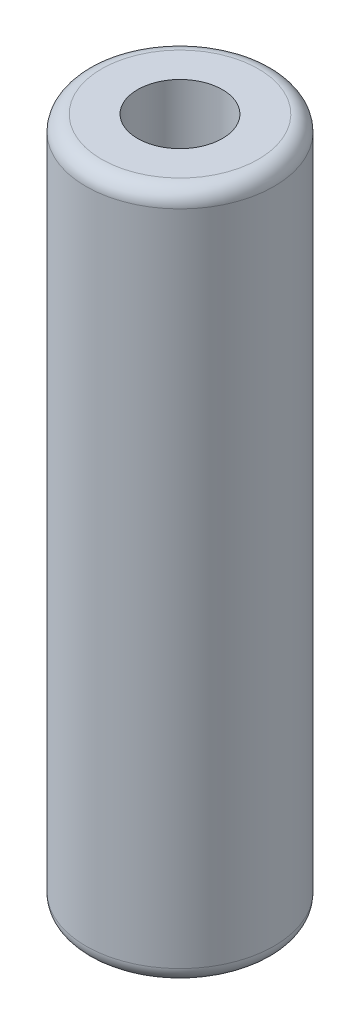
ISO-10303-21;
HEADER;
FILE_DESCRIPTION(('STEP AP214'),'2;1');
FILE_NAME('part.step','',(''),(''),'','','');
FILE_SCHEMA(('AUTOMOTIVE_DESIGN { 1 0 10303 214 1 1 1 1 }'));
ENDSEC;
DATA;
#1=APPLICATION_CONTEXT('core data for automotive mechanical design processes');
#2=APPLICATION_PROTOCOL_DEFINITION('international standard','automotive_design',2000,#1);
#3=PRODUCT_CONTEXT('',#1,'mechanical');
#4=PRODUCT('Part','Part','',(#3));
#5=PRODUCT_RELATED_PRODUCT_CATEGORY('part','',(#4));
#6=PRODUCT_DEFINITION_FORMATION('','',#4);
#7=PRODUCT_DEFINITION_CONTEXT('part definition',#1,'design');
#8=PRODUCT_DEFINITION('design','',#6,#7);
#9=PRODUCT_DEFINITION_SHAPE('','',#8);
#10=(LENGTH_UNIT() NAMED_UNIT(*) SI_UNIT(.MILLI.,.METRE.));
#11=(NAMED_UNIT(*) PLANE_ANGLE_UNIT() SI_UNIT($,.RADIAN.));
#12=(NAMED_UNIT(*) SI_UNIT($,.STERADIAN.) SOLID_ANGLE_UNIT());
#13=UNCERTAINTY_MEASURE_WITH_UNIT(LENGTH_MEASURE(1.E-05),#10,'distance_accuracy_value','');
#14=(GEOMETRIC_REPRESENTATION_CONTEXT(3) GLOBAL_UNCERTAINTY_ASSIGNED_CONTEXT((#13)) GLOBAL_UNIT_ASSIGNED_CONTEXT((#10,
#11,#12)) REPRESENTATION_CONTEXT('',''));
#15=CARTESIAN_POINT('',(0.,0.,0.));
#16=DIRECTION('',(0.,0.,1.));
#17=DIRECTION('',(1.,0.,0.));
#18=AXIS2_PLACEMENT_3D('',#15,#16,#17);
#19=CARTESIAN_POINT('',(0.,-10.99,0.));
#20=DIRECTION('',(0.,1.,0.));
#21=DIRECTION('',(0.,0.,1.));
#22=AXIS2_PLACEMENT_3D('',#19,#20,#21);
#23=CYLINDRICAL_SURFACE('',#22,3.);
#24=CARTESIAN_POINT('',(0.,-10.49,0.));
#25=DIRECTION('',(0.,1.,0.));
#26=DIRECTION('',(0.,0.,1.));
#27=AXIS2_PLACEMENT_3D('',#24,#25,#26);
#28=CIRCLE('',#27,3.);
#29=CARTESIAN_POINT('',(0.,-10.49,3.));
#30=VERTEX_POINT('',#29);
#31=EDGE_CURVE('E73',#30,#30,#28,.T.);
#32=ORIENTED_EDGE('',*,*,#31,.T.);
#33=EDGE_LOOP('',(#32));
#34=FACE_BOUND('',#33,.T.);
#35=CARTESIAN_POINT('',(0.,10.49,0.));
#36=DIRECTION('',(0.,1.,0.));
#37=DIRECTION('',(0.,0.,1.));
#38=AXIS2_PLACEMENT_3D('',#35,#36,#37);
#39=CIRCLE('',#38,3.);
#40=CARTESIAN_POINT('',(0.,10.49,3.));
#41=VERTEX_POINT('',#40);
#42=EDGE_CURVE('E70',#41,#41,#39,.F.);
#43=ORIENTED_EDGE('',*,*,#42,.T.);
#44=EDGE_LOOP('',(#43));
#45=FACE_BOUND('',#44,.T.);
#46=ADVANCED_FACE('F36',(#34,#45),#23,.T.);
#47=CARTESIAN_POINT('',(0.,-10.99,0.));
#48=DIRECTION('',(0.,1.,0.));
#49=DIRECTION('',(0.,0.,1.));
#50=AXIS2_PLACEMENT_3D('',#47,#48,#49);
#51=PLANE('',#50);
#52=CARTESIAN_POINT('',(0.,-10.99,0.));
#53=DIRECTION('',(0.,-1.,0.));
#54=DIRECTION('',(0.,0.,-1.));
#55=AXIS2_PLACEMENT_3D('',#52,#53,#54);
#56=CIRCLE('',#55,1.35255);
#57=CARTESIAN_POINT('',(0.,-10.99,-1.35255));
#58=VERTEX_POINT('',#57);
#59=EDGE_CURVE('E60',#58,#58,#56,.T.);
#60=ORIENTED_EDGE('',*,*,#59,.F.);
#61=EDGE_LOOP('',(#60));
#62=FACE_BOUND('',#61,.T.);
#63=CARTESIAN_POINT('',(0.,-10.99,0.));
#64=DIRECTION('',(0.,1.,0.));
#65=DIRECTION('',(0.,0.,1.));
#66=AXIS2_PLACEMENT_3D('',#63,#64,#65);
#67=CIRCLE('',#66,2.5);
#68=CARTESIAN_POINT('',(0.,-10.99,2.5));
#69=VERTEX_POINT('',#68);
#70=EDGE_CURVE('E44',#69,#69,#67,.F.);
#71=ORIENTED_EDGE('',*,*,#70,.T.);
#72=EDGE_LOOP('',(#71));
#73=FACE_BOUND('',#72,.T.);
#74=ADVANCED_FACE('F78',(#62,#73),#51,.F.);
#75=CARTESIAN_POINT('',(0.,10.99,0.));
#76=DIRECTION('',(0.,1.,0.));
#77=DIRECTION('',(0.,0.,1.));
#78=AXIS2_PLACEMENT_3D('',#75,#76,#77);
#79=PLANE('',#78);
#80=CARTESIAN_POINT('',(0.,10.99,0.));
#81=DIRECTION('',(0.,1.,0.));
#82=DIRECTION('',(0.,0.,1.));
#83=AXIS2_PLACEMENT_3D('',#80,#81,#82);
#84=CIRCLE('',#83,2.5);
#85=CARTESIAN_POINT('',(0.,10.99,2.5));
#86=VERTEX_POINT('',#85);
#87=EDGE_CURVE('E11',#86,#86,#84,.T.);
#88=ORIENTED_EDGE('',*,*,#87,.T.);
#89=EDGE_LOOP('',(#88));
#90=FACE_BOUND('',#89,.T.);
#91=CARTESIAN_POINT('',(0.,10.99,0.));
#92=DIRECTION('',(0.,1.,0.));
#93=DIRECTION('',(0.,0.,1.));
#94=AXIS2_PLACEMENT_3D('',#91,#92,#93);
#95=CIRCLE('',#94,1.35255);
#96=CARTESIAN_POINT('',(0.,10.99,1.35255));
#97=VERTEX_POINT('',#96);
#98=EDGE_CURVE('E59',#97,#97,#95,.T.);
#99=ORIENTED_EDGE('',*,*,#98,.F.);
#100=EDGE_LOOP('',(#99));
#101=FACE_BOUND('',#100,.T.);
#102=ADVANCED_FACE('F95',(#90,#101),#79,.T.);
#103=CARTESIAN_POINT('',(0.,2.99,0.));
#104=DIRECTION('',(0.,1.,0.));
#105=DIRECTION('',(0.,0.,1.));
#106=AXIS2_PLACEMENT_3D('',#103,#104,#105);
#107=CONICAL_SURFACE('',#106,1.35255,1.02974425867665);
#108=CARTESIAN_POINT('',(0.,2.17730596973427,0.));
#109=VERTEX_POINT('',#108);
#110=VERTEX_LOOP('',#109);
#111=FACE_BOUND('',#110,.T.);
#112=CARTESIAN_POINT('',(0.,2.99,0.));
#113=DIRECTION('',(0.,1.,0.));
#114=DIRECTION('',(0.,0.,1.));
#115=AXIS2_PLACEMENT_3D('',#112,#113,#114);
#116=CIRCLE('',#115,1.35255);
#117=CARTESIAN_POINT('',(0.,2.99,1.35255));
#118=VERTEX_POINT('',#117);
#119=EDGE_CURVE('E63',#118,#118,#116,.T.);
#120=ORIENTED_EDGE('',*,*,#119,.T.);
#121=EDGE_LOOP('',(#120));
#122=FACE_BOUND('',#121,.T.);
#123=ADVANCED_FACE('F98',(#111,#122),#107,.F.);
#124=CARTESIAN_POINT('',(0.,10.99,0.));
#125=DIRECTION('',(0.,1.,0.));
#126=DIRECTION('',(0.,0.,1.));
#127=AXIS2_PLACEMENT_3D('',#124,#125,#126);
#128=CYLINDRICAL_SURFACE('',#127,1.35255);
#129=ORIENTED_EDGE('',*,*,#119,.F.);
#130=EDGE_LOOP('',(#129));
#131=FACE_BOUND('',#130,.T.);
#132=ORIENTED_EDGE('',*,*,#98,.T.);
#133=EDGE_LOOP('',(#132));
#134=FACE_BOUND('',#133,.T.);
#135=ADVANCED_FACE('F83',(#131,#134),#128,.F.);
#136=CARTESIAN_POINT('',(0.,-10.49,0.));
#137=DIRECTION('',(0.,1.,0.));
#138=DIRECTION('',(0.,0.,1.));
#139=AXIS2_PLACEMENT_3D('',#136,#137,#138);
#140=TOROIDAL_SURFACE('',#139,2.5,0.5);
#141=ORIENTED_EDGE('',*,*,#70,.F.);
#142=EDGE_LOOP('',(#141));
#143=FACE_BOUND('',#142,.T.);
#144=ORIENTED_EDGE('',*,*,#31,.F.);
#145=EDGE_LOOP('',(#144));
#146=FACE_BOUND('',#145,.T.);
#147=ADVANCED_FACE('F80',(#143,#146),#140,.T.);
#148=CARTESIAN_POINT('',(0.,10.49,0.));
#149=DIRECTION('',(0.,1.,0.));
#150=DIRECTION('',(0.,0.,1.));
#151=AXIS2_PLACEMENT_3D('',#148,#149,#150);
#152=TOROIDAL_SURFACE('',#151,2.5,0.5);
#153=ORIENTED_EDGE('',*,*,#42,.F.);
#154=EDGE_LOOP('',(#153));
#155=FACE_BOUND('',#154,.T.);
#156=ORIENTED_EDGE('',*,*,#87,.F.);
#157=EDGE_LOOP('',(#156));
#158=FACE_BOUND('',#157,.T.);
#159=ADVANCED_FACE('F38',(#155,#158),#152,.T.);
#160=CARTESIAN_POINT('',(0.,-2.99,0.));
#161=DIRECTION('',(0.,-1.,0.));
#162=DIRECTION('',(0.,0.,-1.));
#163=AXIS2_PLACEMENT_3D('',#160,#161,#162);
#164=CONICAL_SURFACE('',#163,1.35255,1.02974425867665);
#165=CARTESIAN_POINT('',(0.,-2.17730596973427,0.));
#166=VERTEX_POINT('',#165);
#167=VERTEX_LOOP('',#166);
#168=FACE_BOUND('',#167,.T.);
#169=CARTESIAN_POINT('',(0.,-2.99,0.));
#170=DIRECTION('',(0.,-1.,0.));
#171=DIRECTION('',(0.,0.,-1.));
#172=AXIS2_PLACEMENT_3D('',#169,#170,#171);
#173=CIRCLE('',#172,1.35255);
#174=CARTESIAN_POINT('',(0.,-2.99,-1.35255));
#175=VERTEX_POINT('',#174);
#176=EDGE_CURVE('E57',#175,#175,#173,.T.);
#177=ORIENTED_EDGE('',*,*,#176,.T.);
#178=EDGE_LOOP('',(#177));
#179=FACE_BOUND('',#178,.T.);
#180=ADVANCED_FACE('F50',(#168,#179),#164,.F.);
#181=CARTESIAN_POINT('',(0.,-10.99,0.));
#182=DIRECTION('',(0.,-1.,0.));
#183=DIRECTION('',(0.,0.,-1.));
#184=AXIS2_PLACEMENT_3D('',#181,#182,#183);
#185=CYLINDRICAL_SURFACE('',#184,1.35255);
#186=ORIENTED_EDGE('',*,*,#176,.F.);
#187=EDGE_LOOP('',(#186));
#188=FACE_BOUND('',#187,.T.);
#189=ORIENTED_EDGE('',*,*,#59,.T.);
#190=EDGE_LOOP('',(#189));
#191=FACE_BOUND('',#190,.T.);
#192=ADVANCED_FACE('F53',(#188,#191),#185,.F.);
#193=CLOSED_SHELL('',(#46,#74,#102,#123,#135,#147,#159,#180,#192));
#194=MANIFOLD_SOLID_BREP('B2',#193);
#195=ADVANCED_BREP_SHAPE_REPRESENTATION('',(#18,#194),#14);
#196=SHAPE_DEFINITION_REPRESENTATION(#9,#195);
ENDSEC;
END-ISO-10303-21;
